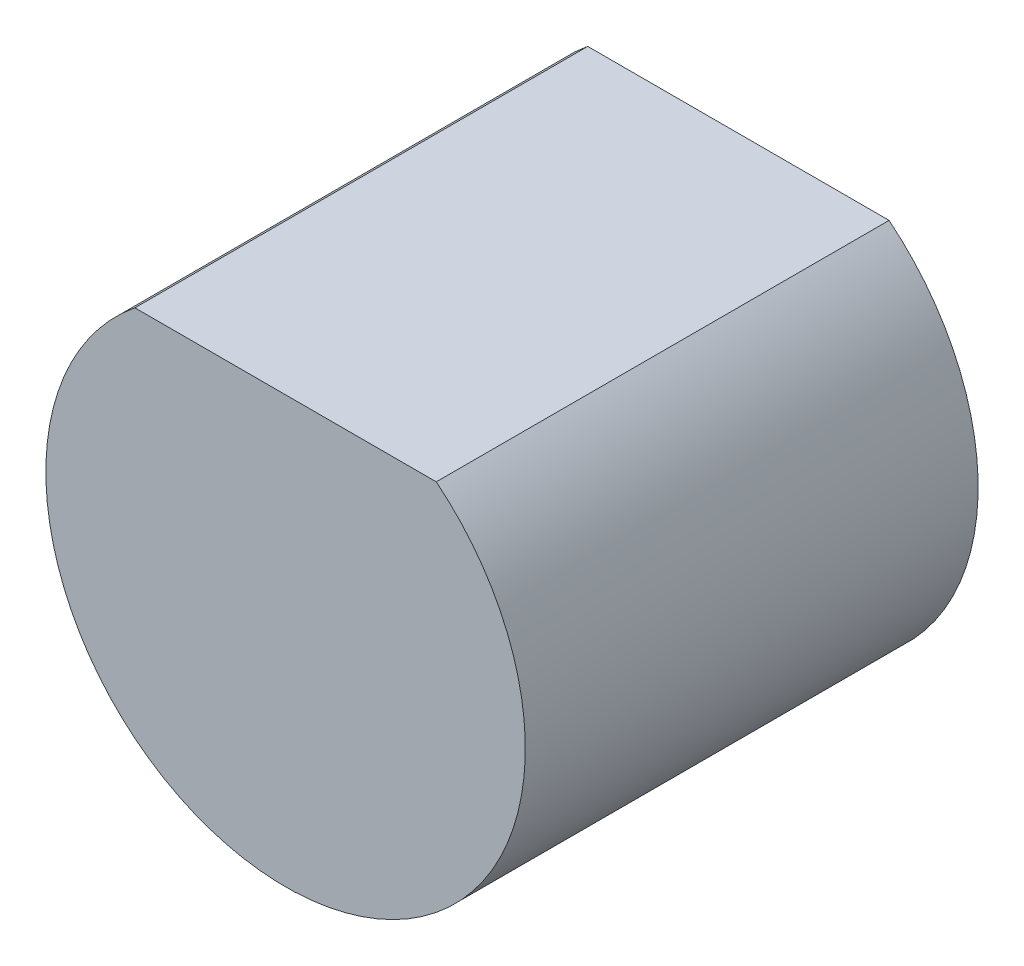
ISO-10303-21;
HEADER;
FILE_DESCRIPTION(('STEP AP214'),'2;1');
FILE_NAME('part.step','',(''),(''),'','','');
FILE_SCHEMA(('AUTOMOTIVE_DESIGN { 1 0 10303 214 1 1 1 1 }'));
ENDSEC;
DATA;
#1=APPLICATION_CONTEXT('core data for automotive mechanical design processes');
#2=APPLICATION_PROTOCOL_DEFINITION('international standard','automotive_design',2000,#1);
#3=PRODUCT_CONTEXT('',#1,'mechanical');
#4=PRODUCT('Part','Part','',(#3));
#5=PRODUCT_RELATED_PRODUCT_CATEGORY('part','',(#4));
#6=PRODUCT_DEFINITION_FORMATION('','',#4);
#7=PRODUCT_DEFINITION_CONTEXT('part definition',#1,'design');
#8=PRODUCT_DEFINITION('design','',#6,#7);
#9=PRODUCT_DEFINITION_SHAPE('','',#8);
#10=(LENGTH_UNIT() NAMED_UNIT(*) SI_UNIT(.MILLI.,.METRE.));
#11=(NAMED_UNIT(*) PLANE_ANGLE_UNIT() SI_UNIT($,.RADIAN.));
#12=(NAMED_UNIT(*) SI_UNIT($,.STERADIAN.) SOLID_ANGLE_UNIT());
#13=UNCERTAINTY_MEASURE_WITH_UNIT(LENGTH_MEASURE(1.E-05),#10,'distance_accuracy_value','');
#14=(GEOMETRIC_REPRESENTATION_CONTEXT(3) GLOBAL_UNCERTAINTY_ASSIGNED_CONTEXT((#13)) GLOBAL_UNIT_ASSIGNED_CONTEXT((#10,
#11,#12)) REPRESENTATION_CONTEXT('',''));
#15=CARTESIAN_POINT('',(0.,0.,0.));
#16=DIRECTION('',(0.,0.,1.));
#17=DIRECTION('',(1.,0.,0.));
#18=AXIS2_PLACEMENT_3D('',#15,#16,#17);
#19=CARTESIAN_POINT('',(0.,0.,4.318));
#20=DIRECTION('',(0.,0.,-1.));
#21=DIRECTION('',(-1.,0.,0.));
#22=AXIS2_PLACEMENT_3D('',#19,#20,#21);
#23=CYLINDRICAL_SURFACE('',#22,2.286);
#24=CARTESIAN_POINT('',(0.,0.,4.318));
#25=DIRECTION('',(0.,0.,1.));
#26=DIRECTION('',(1.,0.,0.));
#27=AXIS2_PLACEMENT_3D('',#24,#25,#26);
#28=CIRCLE('',#27,2.286);
#29=CARTESIAN_POINT('',(-1.43684097937106,1.778,4.318));
#30=VERTEX_POINT('',#29);
#31=CARTESIAN_POINT('',(1.43684097937106,1.778,4.318));
#32=VERTEX_POINT('',#31);
#33=EDGE_CURVE('E11',#30,#32,#28,.T.);
#34=ORIENTED_EDGE('',*,*,#33,.F.);
#35=DIRECTION('',(0.,0.,1.));
#36=VECTOR('',#35,1.);
#37=CARTESIAN_POINT('',(-1.43684097937106,1.778,0.));
#38=LINE('',#37,#36);
#39=CARTESIAN_POINT('',(-1.43684097937106,1.778,0.));
#40=VERTEX_POINT('',#39);
#41=EDGE_CURVE('E62',#40,#30,#38,.T.);
#42=ORIENTED_EDGE('',*,*,#41,.F.);
#43=CARTESIAN_POINT('',(0.,0.,0.));
#44=DIRECTION('',(0.,0.,1.));
#45=DIRECTION('',(1.,0.,0.));
#46=AXIS2_PLACEMENT_3D('',#43,#44,#45);
#47=CIRCLE('',#46,2.286);
#48=CARTESIAN_POINT('',(1.43684097937106,1.778,0.));
#49=VERTEX_POINT('',#48);
#50=EDGE_CURVE('E42',#40,#49,#47,.T.);
#51=ORIENTED_EDGE('',*,*,#50,.T.);
#52=DIRECTION('',(0.,0.,1.));
#53=VECTOR('',#52,1.);
#54=CARTESIAN_POINT('',(1.43684097937106,1.778,0.));
#55=LINE('',#54,#53);
#56=EDGE_CURVE('E53',#49,#32,#55,.T.);
#57=ORIENTED_EDGE('',*,*,#56,.T.);
#58=EDGE_LOOP('',(#34,#42,#51,#57));
#59=FACE_BOUND('',#58,.T.);
#60=ADVANCED_FACE('F39',(#59),#23,.T.);
#61=CARTESIAN_POINT('',(0.,0.,4.318));
#62=DIRECTION('',(0.,0.,1.));
#63=DIRECTION('',(1.,0.,0.));
#64=AXIS2_PLACEMENT_3D('',#61,#62,#63);
#65=PLANE('',#64);
#66=DIRECTION('',(1.,0.,0.));
#67=VECTOR('',#66,1.);
#68=CARTESIAN_POINT('',(-1.43684097937106,1.778,4.318));
#69=LINE('',#68,#67);
#70=EDGE_CURVE('E65',#30,#32,#69,.T.);
#71=ORIENTED_EDGE('',*,*,#70,.F.);
#72=ORIENTED_EDGE('',*,*,#33,.T.);
#73=EDGE_LOOP('',(#71,#72));
#74=FACE_BOUND('',#73,.T.);
#75=ADVANCED_FACE('F72',(#74),#65,.T.);
#76=CARTESIAN_POINT('',(0.,0.,0.));
#77=DIRECTION('',(0.,0.,1.));
#78=DIRECTION('',(1.,0.,0.));
#79=AXIS2_PLACEMENT_3D('',#76,#77,#78);
#80=PLANE('',#79);
#81=ORIENTED_EDGE('',*,*,#50,.F.);
#82=DIRECTION('',(1.,0.,0.));
#83=VECTOR('',#82,1.);
#84=CARTESIAN_POINT('',(-1.43684097937106,1.778,0.));
#85=LINE('',#84,#83);
#86=EDGE_CURVE('E58',#40,#49,#85,.T.);
#87=ORIENTED_EDGE('',*,*,#86,.T.);
#88=EDGE_LOOP('',(#81,#87));
#89=FACE_BOUND('',#88,.T.);
#90=ADVANCED_FACE('F77',(#89),#80,.F.);
#91=CARTESIAN_POINT('',(-1.43684097937106,1.778,0.));
#92=DIRECTION('',(0.,-1.,0.));
#93=DIRECTION('',(0.,0.,-1.));
#94=AXIS2_PLACEMENT_3D('',#91,#92,#93);
#95=PLANE('',#94);
#96=ORIENTED_EDGE('',*,*,#70,.T.);
#97=ORIENTED_EDGE('',*,*,#56,.F.);
#98=ORIENTED_EDGE('',*,*,#86,.F.);
#99=ORIENTED_EDGE('',*,*,#41,.T.);
#100=EDGE_LOOP('',(#96,#97,#98,#99));
#101=FACE_BOUND('',#100,.T.);
#102=ADVANCED_FACE('F64',(#101),#95,.F.);
#103=CLOSED_SHELL('',(#60,#75,#90,#102));
#104=MANIFOLD_SOLID_BREP('B2',#103);
#105=ADVANCED_BREP_SHAPE_REPRESENTATION('',(#18,#104),#14);
#106=SHAPE_DEFINITION_REPRESENTATION(#9,#105);
ENDSEC;
END-ISO-10303-21;
